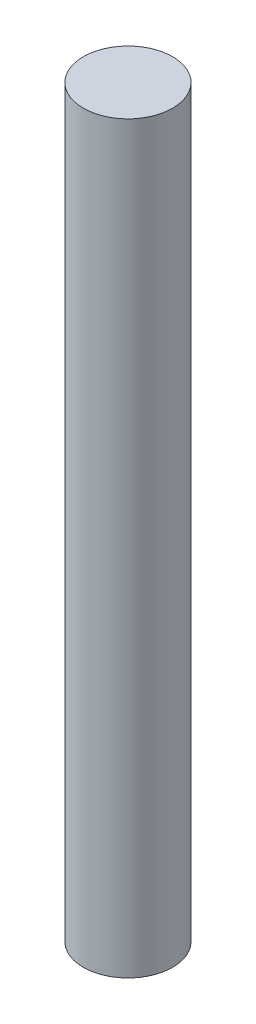
ISO-10303-21;
HEADER;
FILE_DESCRIPTION(('STEP AP214'),'2;1');
FILE_NAME('part.step','',(''),(''),'','','');
FILE_SCHEMA(('AUTOMOTIVE_DESIGN { 1 0 10303 214 1 1 1 1 }'));
ENDSEC;
DATA;
#1=APPLICATION_CONTEXT('core data for automotive mechanical design processes');
#2=APPLICATION_PROTOCOL_DEFINITION('international standard','automotive_design',2000,#1);
#3=PRODUCT_CONTEXT('',#1,'mechanical');
#4=PRODUCT('Part','Part','',(#3));
#5=PRODUCT_RELATED_PRODUCT_CATEGORY('part','',(#4));
#6=PRODUCT_DEFINITION_FORMATION('','',#4);
#7=PRODUCT_DEFINITION_CONTEXT('part definition',#1,'design');
#8=PRODUCT_DEFINITION('design','',#6,#7);
#9=PRODUCT_DEFINITION_SHAPE('','',#8);
#10=(LENGTH_UNIT() NAMED_UNIT(*) SI_UNIT(.MILLI.,.METRE.));
#11=(NAMED_UNIT(*) PLANE_ANGLE_UNIT() SI_UNIT($,.RADIAN.));
#12=(NAMED_UNIT(*) SI_UNIT($,.STERADIAN.) SOLID_ANGLE_UNIT());
#13=UNCERTAINTY_MEASURE_WITH_UNIT(LENGTH_MEASURE(1.E-05),#10,'distance_accuracy_value','');
#14=(GEOMETRIC_REPRESENTATION_CONTEXT(3) GLOBAL_UNCERTAINTY_ASSIGNED_CONTEXT((#13)) GLOBAL_UNIT_ASSIGNED_CONTEXT((#10,
#11,#12)) REPRESENTATION_CONTEXT('',''));
#15=CARTESIAN_POINT('',(0.,0.,0.));
#16=DIRECTION('',(0.,0.,1.));
#17=DIRECTION('',(1.,0.,0.));
#18=AXIS2_PLACEMENT_3D('',#15,#16,#17);
#19=CARTESIAN_POINT('',(0.,25.,0.));
#20=DIRECTION('',(0.,-1.,0.));
#21=DIRECTION('',(0.,0.,-1.));
#22=AXIS2_PLACEMENT_3D('',#19,#20,#21);
#23=CYLINDRICAL_SURFACE('',#22,1.5);
#24=CARTESIAN_POINT('',(0.,25.,0.));
#25=DIRECTION('',(0.,1.,0.));
#26=DIRECTION('',(0.,0.,1.));
#27=AXIS2_PLACEMENT_3D('',#24,#25,#26);
#28=CIRCLE('',#27,1.5);
#29=CARTESIAN_POINT('',(0.,25.,1.5));
#30=VERTEX_POINT('',#29);
#31=EDGE_CURVE('E10',#30,#30,#28,.T.);
#32=ORIENTED_EDGE('',*,*,#31,.F.);
#33=EDGE_LOOP('',(#32));
#34=FACE_BOUND('',#33,.T.);
#35=CARTESIAN_POINT('',(0.,0.,0.));
#36=DIRECTION('',(0.,1.,0.));
#37=DIRECTION('',(0.,0.,1.));
#38=AXIS2_PLACEMENT_3D('',#35,#36,#37);
#39=CIRCLE('',#38,1.5);
#40=CARTESIAN_POINT('',(0.,0.,1.5));
#41=VERTEX_POINT('',#40);
#42=EDGE_CURVE('E40',#41,#41,#39,.T.);
#43=ORIENTED_EDGE('',*,*,#42,.T.);
#44=EDGE_LOOP('',(#43));
#45=FACE_BOUND('',#44,.T.);
#46=ADVANCED_FACE('F37',(#34,#45),#23,.T.);
#47=CARTESIAN_POINT('',(0.,25.,0.));
#48=DIRECTION('',(0.,1.,0.));
#49=DIRECTION('',(0.,0.,1.));
#50=AXIS2_PLACEMENT_3D('',#47,#48,#49);
#51=PLANE('',#50);
#52=ORIENTED_EDGE('',*,*,#31,.T.);
#53=EDGE_LOOP('',(#52));
#54=FACE_BOUND('',#53,.T.);
#55=ADVANCED_FACE('F54',(#54),#51,.T.);
#56=CARTESIAN_POINT('',(0.,0.,0.));
#57=DIRECTION('',(0.,1.,0.));
#58=DIRECTION('',(0.,0.,1.));
#59=AXIS2_PLACEMENT_3D('',#56,#57,#58);
#60=PLANE('',#59);
#61=ORIENTED_EDGE('',*,*,#42,.F.);
#62=EDGE_LOOP('',(#61));
#63=FACE_BOUND('',#62,.T.);
#64=ADVANCED_FACE('F52',(#63),#60,.F.);
#65=CLOSED_SHELL('',(#46,#55,#64));
#66=MANIFOLD_SOLID_BREP('B2',#65);
#67=ADVANCED_BREP_SHAPE_REPRESENTATION('',(#18,#66),#14);
#68=SHAPE_DEFINITION_REPRESENTATION(#9,#67);
ENDSEC;
END-ISO-10303-21;
